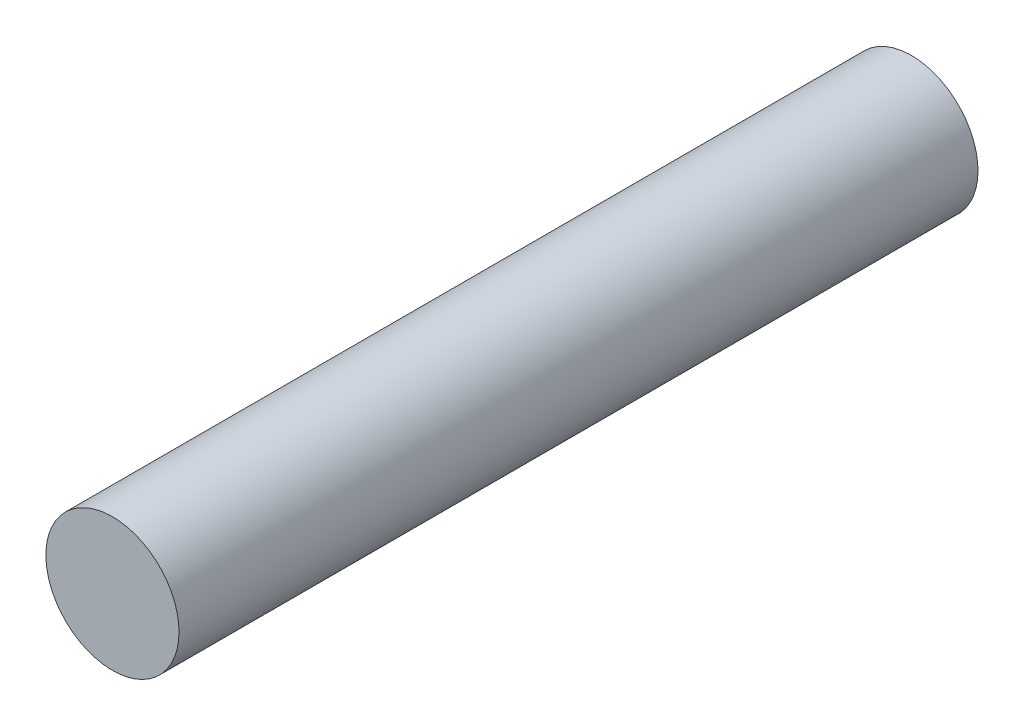
ISO-10303-21;
HEADER;
FILE_DESCRIPTION(('STEP AP214'),'2;1');
FILE_NAME('part.step','',(''),(''),'','','');
FILE_SCHEMA(('AUTOMOTIVE_DESIGN { 1 0 10303 214 1 1 1 1 }'));
ENDSEC;
DATA;
#1=APPLICATION_CONTEXT('core data for automotive mechanical design processes');
#2=APPLICATION_PROTOCOL_DEFINITION('international standard','automotive_design',2000,#1);
#3=PRODUCT_CONTEXT('',#1,'mechanical');
#4=PRODUCT('Part','Part','',(#3));
#5=PRODUCT_RELATED_PRODUCT_CATEGORY('part','',(#4));
#6=PRODUCT_DEFINITION_FORMATION('','',#4);
#7=PRODUCT_DEFINITION_CONTEXT('part definition',#1,'design');
#8=PRODUCT_DEFINITION('design','',#6,#7);
#9=PRODUCT_DEFINITION_SHAPE('','',#8);
#10=(LENGTH_UNIT() NAMED_UNIT(*) SI_UNIT(.MILLI.,.METRE.));
#11=(NAMED_UNIT(*) PLANE_ANGLE_UNIT() SI_UNIT($,.RADIAN.));
#12=(NAMED_UNIT(*) SI_UNIT($,.STERADIAN.) SOLID_ANGLE_UNIT());
#13=UNCERTAINTY_MEASURE_WITH_UNIT(LENGTH_MEASURE(1.E-05),#10,'distance_accuracy_value','');
#14=(GEOMETRIC_REPRESENTATION_CONTEXT(3) GLOBAL_UNCERTAINTY_ASSIGNED_CONTEXT((#13)) GLOBAL_UNIT_ASSIGNED_CONTEXT((#10,
#11,#12)) REPRESENTATION_CONTEXT('',''));
#15=CARTESIAN_POINT('',(0.,0.,0.));
#16=DIRECTION('',(0.,0.,1.));
#17=DIRECTION('',(1.,0.,0.));
#18=AXIS2_PLACEMENT_3D('',#15,#16,#17);
#19=CARTESIAN_POINT('',(0.,0.,12.));
#20=DIRECTION('',(0.,0.,-1.));
#21=DIRECTION('',(-1.,0.,0.));
#22=AXIS2_PLACEMENT_3D('',#19,#20,#21);
#23=CYLINDRICAL_SURFACE('',#22,1.);
#24=CARTESIAN_POINT('',(0.,0.,12.));
#25=DIRECTION('',(0.,0.,1.));
#26=DIRECTION('',(1.,0.,0.));
#27=AXIS2_PLACEMENT_3D('',#24,#25,#26);
#28=CIRCLE('',#27,1.);
#29=CARTESIAN_POINT('',(1.,0.,12.));
#30=VERTEX_POINT('',#29);
#31=EDGE_CURVE('E10',#30,#30,#28,.T.);
#32=ORIENTED_EDGE('',*,*,#31,.F.);
#33=EDGE_LOOP('',(#32));
#34=FACE_BOUND('',#33,.T.);
#35=CARTESIAN_POINT('',(0.,0.,0.));
#36=DIRECTION('',(0.,0.,1.));
#37=DIRECTION('',(1.,0.,0.));
#38=AXIS2_PLACEMENT_3D('',#35,#36,#37);
#39=CIRCLE('',#38,1.);
#40=CARTESIAN_POINT('',(1.,0.,0.));
#41=VERTEX_POINT('',#40);
#42=EDGE_CURVE('E40',#41,#41,#39,.T.);
#43=ORIENTED_EDGE('',*,*,#42,.T.);
#44=EDGE_LOOP('',(#43));
#45=FACE_BOUND('',#44,.T.);
#46=ADVANCED_FACE('F37',(#34,#45),#23,.T.);
#47=CARTESIAN_POINT('',(0.,0.,12.));
#48=DIRECTION('',(0.,0.,1.));
#49=DIRECTION('',(1.,0.,0.));
#50=AXIS2_PLACEMENT_3D('',#47,#48,#49);
#51=PLANE('',#50);
#52=ORIENTED_EDGE('',*,*,#31,.T.);
#53=EDGE_LOOP('',(#52));
#54=FACE_BOUND('',#53,.T.);
#55=ADVANCED_FACE('F54',(#54),#51,.T.);
#56=CARTESIAN_POINT('',(0.,0.,0.));
#57=DIRECTION('',(0.,0.,1.));
#58=DIRECTION('',(1.,0.,0.));
#59=AXIS2_PLACEMENT_3D('',#56,#57,#58);
#60=PLANE('',#59);
#61=ORIENTED_EDGE('',*,*,#42,.F.);
#62=EDGE_LOOP('',(#61));
#63=FACE_BOUND('',#62,.T.);
#64=ADVANCED_FACE('F52',(#63),#60,.F.);
#65=CLOSED_SHELL('',(#46,#55,#64));
#66=MANIFOLD_SOLID_BREP('B2',#65);
#67=ADVANCED_BREP_SHAPE_REPRESENTATION('',(#18,#66),#14);
#68=SHAPE_DEFINITION_REPRESENTATION(#9,#67);
ENDSEC;
END-ISO-10303-21;
